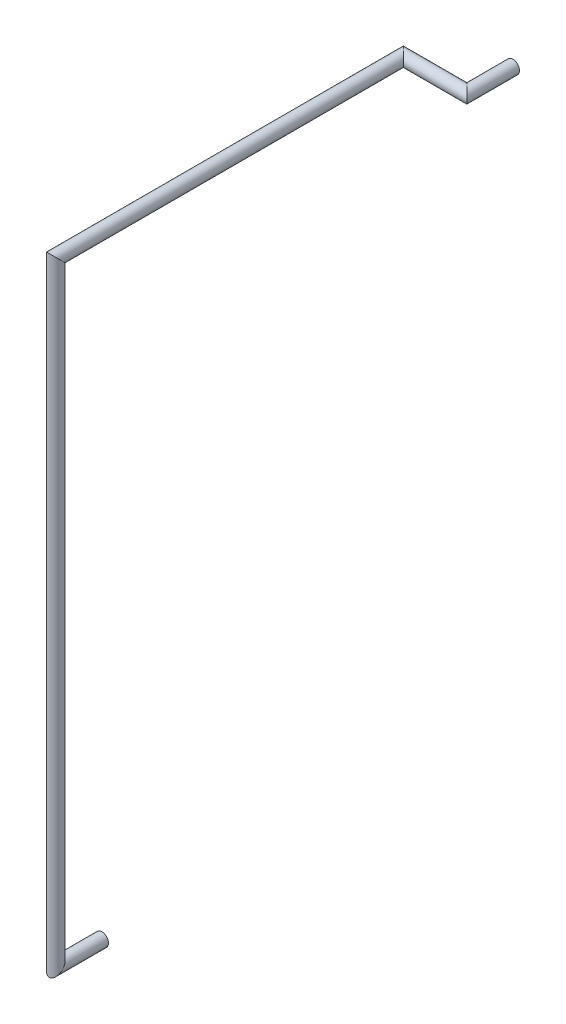
ISO-10303-21;
HEADER;
FILE_DESCRIPTION(('STEP AP214'),'2;1');
FILE_NAME('part.step','',(''),(''),'','','');
FILE_SCHEMA(('AUTOMOTIVE_DESIGN { 1 0 10303 214 1 1 1 1 }'));
ENDSEC;
DATA;
#1=APPLICATION_CONTEXT('core data for automotive mechanical design processes');
#2=APPLICATION_PROTOCOL_DEFINITION('international standard','automotive_design',2000,#1);
#3=PRODUCT_CONTEXT('',#1,'mechanical');
#4=PRODUCT('Part','Part','',(#3));
#5=PRODUCT_RELATED_PRODUCT_CATEGORY('part','',(#4));
#6=PRODUCT_DEFINITION_FORMATION('','',#4);
#7=PRODUCT_DEFINITION_CONTEXT('part definition',#1,'design');
#8=PRODUCT_DEFINITION('design','',#6,#7);
#9=PRODUCT_DEFINITION_SHAPE('','',#8);
#10=(LENGTH_UNIT() NAMED_UNIT(*) SI_UNIT(.MILLI.,.METRE.));
#11=(NAMED_UNIT(*) PLANE_ANGLE_UNIT() SI_UNIT($,.RADIAN.));
#12=(NAMED_UNIT(*) SI_UNIT($,.STERADIAN.) SOLID_ANGLE_UNIT());
#13=UNCERTAINTY_MEASURE_WITH_UNIT(LENGTH_MEASURE(1.E-05),#10,'distance_accuracy_value','');
#14=(GEOMETRIC_REPRESENTATION_CONTEXT(3) GLOBAL_UNCERTAINTY_ASSIGNED_CONTEXT((#13)) GLOBAL_UNIT_ASSIGNED_CONTEXT((#10,
#11,#12)) REPRESENTATION_CONTEXT('',''));
#15=CARTESIAN_POINT('',(0.,0.,0.));
#16=DIRECTION('',(0.,0.,1.));
#17=DIRECTION('',(1.,0.,0.));
#18=AXIS2_PLACEMENT_3D('',#15,#16,#17);
#19=CARTESIAN_POINT('',(4.82,46.6,-26.39));
#20=DIRECTION('',(0.,0.,-1.));
#21=DIRECTION('',(1.,0.,0.));
#22=AXIS2_PLACEMENT_3D('',#19,#20,#21);
#23=PLANE('',#22);
#24=CARTESIAN_POINT('',(4.82,46.6,-26.39));
#25=DIRECTION('',(0.,0.,-1.));
#26=DIRECTION('',(1.,0.,0.));
#27=AXIS2_PLACEMENT_3D('',#24,#25,#26);
#28=CIRCLE('',#27,0.5);
#29=CARTESIAN_POINT('',(5.32,46.6,-26.39));
#30=VERTEX_POINT('',#29);
#31=EDGE_CURVE('E44',#30,#30,#28,.T.);
#32=ORIENTED_EDGE('',*,*,#31,.T.);
#33=EDGE_LOOP('',(#32));
#34=FACE_BOUND('',#33,.T.);
#35=ADVANCED_FACE('F41',(#34),#23,.T.);
#36=CARTESIAN_POINT('',(0.,0.,0.));
#37=DIRECTION('',(0.,0.,1.));
#38=DIRECTION('',(1.,0.,0.));
#39=AXIS2_PLACEMENT_3D('',#36,#37,#38);
#40=PLANE('',#39);
#41=CARTESIAN_POINT('',(0.,0.,0.));
#42=DIRECTION('',(0.,0.,1.));
#43=DIRECTION('',(1.,0.,0.));
#44=AXIS2_PLACEMENT_3D('',#41,#42,#43);
#45=CIRCLE('',#44,0.5);
#46=CARTESIAN_POINT('',(0.5,0.,0.));
#47=VERTEX_POINT('',#46);
#48=EDGE_CURVE('E48',#47,#47,#45,.T.);
#49=ORIENTED_EDGE('',*,*,#48,.F.);
#50=EDGE_LOOP('',(#49));
#51=FACE_BOUND('',#50,.T.);
#52=ADVANCED_FACE('F71',(#51),#40,.F.);
#53=CARTESIAN_POINT('',(4.82,46.6,-22.24));
#54=DIRECTION('',(0.,0.,-1.));
#55=DIRECTION('',(-1.,0.,0.));
#56=AXIS2_PLACEMENT_3D('',#53,#54,#55);
#57=CYLINDRICAL_SURFACE('',#56,0.5);
#58=CARTESIAN_POINT('',(4.82,46.6,-22.89));
#59=DIRECTION('',(0.707106781186547,0.,-0.707106781186547));
#60=DIRECTION('',(0.707106781186548,0.,0.707106781186548));
#61=AXIS2_PLACEMENT_3D('',#58,#59,#60);
#62=ELLIPSE('',#61,0.707106781186548,0.5);
#63=CARTESIAN_POINT('',(5.32,46.6,-22.39));
#64=VERTEX_POINT('',#63);
#65=EDGE_CURVE('E60',#64,#64,#62,.F.);
#66=ORIENTED_EDGE('',*,*,#65,.F.);
#67=EDGE_LOOP('',(#66));
#68=FACE_BOUND('',#67,.T.);
#69=ORIENTED_EDGE('',*,*,#31,.F.);
#70=EDGE_LOOP('',(#69));
#71=FACE_BOUND('',#70,.T.);
#72=ADVANCED_FACE('F68',(#68,#71),#57,.T.);
#73=CARTESIAN_POINT('',(-0.649999999999996,46.6,-22.89));
#74=DIRECTION('',(1.,0.,0.));
#75=DIRECTION('',(0.,0.,-1.));
#76=AXIS2_PLACEMENT_3D('',#73,#74,#75);
#77=CYLINDRICAL_SURFACE('',#76,0.5);
#78=CARTESIAN_POINT('',(0.,46.6,-22.89));
#79=DIRECTION('',(0.707106781186548,0.,-0.707106781186548));
#80=DIRECTION('',(-0.707106781186548,0.,-0.707106781186548));
#81=AXIS2_PLACEMENT_3D('',#78,#79,#80);
#82=ELLIPSE('',#81,0.707106781186547,0.5);
#83=CARTESIAN_POINT('',(-0.5,46.6,-23.39));
#84=VERTEX_POINT('',#83);
#85=EDGE_CURVE('E58',#84,#84,#82,.F.);
#86=ORIENTED_EDGE('',*,*,#85,.F.);
#87=EDGE_LOOP('',(#86));
#88=FACE_BOUND('',#87,.T.);
#89=ORIENTED_EDGE('',*,*,#65,.T.);
#90=EDGE_LOOP('',(#89));
#91=FACE_BOUND('',#90,.T.);
#92=ADVANCED_FACE('F70',(#88,#91),#77,.T.);
#93=CARTESIAN_POINT('',(0.,46.6,4.69999999999999));
#94=DIRECTION('',(0.,0.,-1.));
#95=DIRECTION('',(-1.,0.,0.));
#96=AXIS2_PLACEMENT_3D('',#93,#94,#95);
#97=CYLINDRICAL_SURFACE('',#96,0.5);
#98=CARTESIAN_POINT('',(0.,46.6,3.5));
#99=DIRECTION('',(0.,0.707106781186548,-0.707106781186548));
#100=DIRECTION('',(0.,0.707106781186548,0.707106781186548));
#101=AXIS2_PLACEMENT_3D('',#98,#99,#100);
#102=ELLIPSE('',#101,0.707106781186547,0.5);
#103=CARTESIAN_POINT('',(0.,47.1,4.));
#104=VERTEX_POINT('',#103);
#105=EDGE_CURVE('E53',#104,#104,#102,.F.);
#106=ORIENTED_EDGE('',*,*,#105,.F.);
#107=EDGE_LOOP('',(#106));
#108=FACE_BOUND('',#107,.T.);
#109=ORIENTED_EDGE('',*,*,#85,.T.);
#110=EDGE_LOOP('',(#109));
#111=FACE_BOUND('',#110,.T.);
#112=ADVANCED_FACE('F78',(#108,#111),#97,.T.);
#113=CARTESIAN_POINT('',(0.,-1.2,3.5));
#114=DIRECTION('',(0.,1.,0.));
#115=DIRECTION('',(0.,0.,1.));
#116=AXIS2_PLACEMENT_3D('',#113,#114,#115);
#117=CYLINDRICAL_SURFACE('',#116,0.5);
#118=CARTESIAN_POINT('',(0.,0.,3.5));
#119=DIRECTION('',(0.,0.707106781186547,0.707106781186547));
#120=DIRECTION('',(0.,-0.707106781186548,0.707106781186548));
#121=AXIS2_PLACEMENT_3D('',#118,#119,#120);
#122=ELLIPSE('',#121,0.707106781186548,0.5);
#123=CARTESIAN_POINT('',(0.,-0.5,4.));
#124=VERTEX_POINT('',#123);
#125=EDGE_CURVE('E10',#124,#124,#122,.F.);
#126=ORIENTED_EDGE('',*,*,#125,.F.);
#127=EDGE_LOOP('',(#126));
#128=FACE_BOUND('',#127,.T.);
#129=ORIENTED_EDGE('',*,*,#105,.T.);
#130=EDGE_LOOP('',(#129));
#131=FACE_BOUND('',#130,.T.);
#132=ADVANCED_FACE('F84',(#128,#131),#117,.T.);
#133=CARTESIAN_POINT('',(0.,0.,0.));
#134=DIRECTION('',(0.,0.,1.));
#135=DIRECTION('',(1.,0.,0.));
#136=AXIS2_PLACEMENT_3D('',#133,#134,#135);
#137=CYLINDRICAL_SURFACE('',#136,0.5);
#138=ORIENTED_EDGE('',*,*,#48,.T.);
#139=EDGE_LOOP('',(#138));
#140=FACE_BOUND('',#139,.T.);
#141=ORIENTED_EDGE('',*,*,#125,.T.);
#142=EDGE_LOOP('',(#141));
#143=FACE_BOUND('',#142,.T.);
#144=ADVANCED_FACE('F82',(#140,#143),#137,.T.);
#145=CLOSED_SHELL('',(#35,#52,#72,#92,#112,#132,#144));
#146=MANIFOLD_SOLID_BREP('B2',#145);
#147=ADVANCED_BREP_SHAPE_REPRESENTATION('',(#18,#146),#14);
#148=SHAPE_DEFINITION_REPRESENTATION(#9,#147);
ENDSEC;
END-ISO-10303-21;
